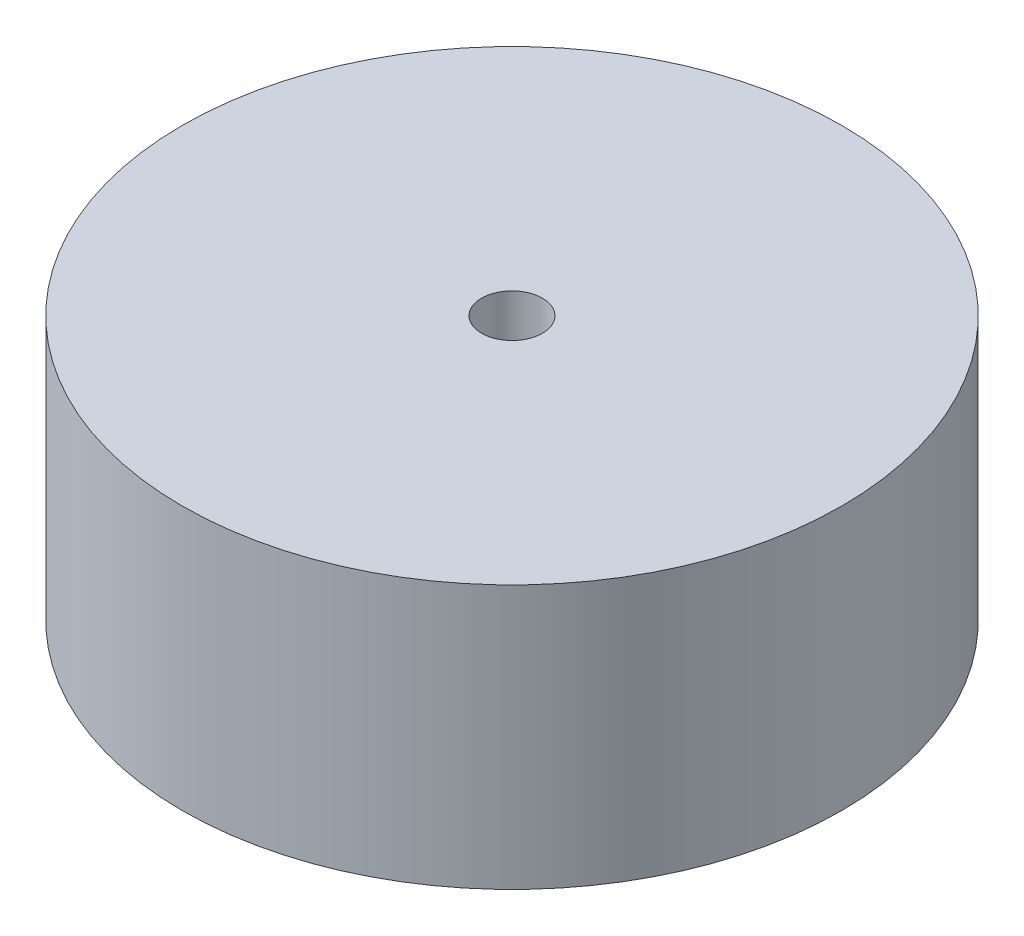
ISO-10303-21;
HEADER;
FILE_DESCRIPTION(('STEP AP214'),'2;1');
FILE_NAME('part.step','',(''),(''),'','','');
FILE_SCHEMA(('AUTOMOTIVE_DESIGN { 1 0 10303 214 1 1 1 1 }'));
ENDSEC;
DATA;
#1=APPLICATION_CONTEXT('core data for automotive mechanical design processes');
#2=APPLICATION_PROTOCOL_DEFINITION('international standard','automotive_design',2000,#1);
#3=PRODUCT_CONTEXT('',#1,'mechanical');
#4=PRODUCT('Part','Part','',(#3));
#5=PRODUCT_RELATED_PRODUCT_CATEGORY('part','',(#4));
#6=PRODUCT_DEFINITION_FORMATION('','',#4);
#7=PRODUCT_DEFINITION_CONTEXT('part definition',#1,'design');
#8=PRODUCT_DEFINITION('design','',#6,#7);
#9=PRODUCT_DEFINITION_SHAPE('','',#8);
#10=(LENGTH_UNIT() NAMED_UNIT(*) SI_UNIT(.MILLI.,.METRE.));
#11=(NAMED_UNIT(*) PLANE_ANGLE_UNIT() SI_UNIT($,.RADIAN.));
#12=(NAMED_UNIT(*) SI_UNIT($,.STERADIAN.) SOLID_ANGLE_UNIT());
#13=UNCERTAINTY_MEASURE_WITH_UNIT(LENGTH_MEASURE(1.E-05),#10,'distance_accuracy_value','');
#14=(GEOMETRIC_REPRESENTATION_CONTEXT(3) GLOBAL_UNCERTAINTY_ASSIGNED_CONTEXT((#13)) GLOBAL_UNIT_ASSIGNED_CONTEXT((#10,
#11,#12)) REPRESENTATION_CONTEXT('',''));
#15=CARTESIAN_POINT('',(0.,0.,0.));
#16=DIRECTION('',(0.,0.,1.));
#17=DIRECTION('',(1.,0.,0.));
#18=AXIS2_PLACEMENT_3D('',#15,#16,#17);
#19=CARTESIAN_POINT('',(0.,26.,0.));
#20=DIRECTION('',(0.,-1.,0.));
#21=DIRECTION('',(0.,0.,-1.));
#22=AXIS2_PLACEMENT_3D('',#19,#20,#21);
#23=CYLINDRICAL_SURFACE('',#22,32.5);
#24=CARTESIAN_POINT('',(0.,26.,0.));
#25=DIRECTION('',(0.,1.,0.));
#26=DIRECTION('',(0.,0.,1.));
#27=AXIS2_PLACEMENT_3D('',#24,#25,#26);
#28=CIRCLE('',#27,32.5);
#29=CARTESIAN_POINT('',(0.,26.,-32.5));
#30=VERTEX_POINT('',#29);
#31=EDGE_CURVE('E45',#30,#30,#28,.T.);
#32=CARTESIAN_POINT('',(0.,0.,0.));
#33=DIRECTION('',(0.,1.,0.));
#34=DIRECTION('',(0.,0.,1.));
#35=AXIS2_PLACEMENT_3D('',#32,#33,#34);
#36=CIRCLE('',#35,32.5);
#37=CARTESIAN_POINT('',(0.,0.,-32.5));
#38=VERTEX_POINT('',#37);
#39=EDGE_CURVE('E40',#38,#38,#36,.T.);
#40=CARTESIAN_POINT('',(0.,26.,-32.5));
#41=CARTESIAN_POINT('',(0.,25.7291666666667,-32.5));
#42=CARTESIAN_POINT('',(0.,25.4583333333333,-32.5));
#43=CARTESIAN_POINT('',(0.,24.9166666666667,-32.5));
#44=CARTESIAN_POINT('',(0.,24.6458333333333,-32.5));
#45=CARTESIAN_POINT('',(0.,24.1041666666667,-32.5));
#46=CARTESIAN_POINT('',(0.,23.8333333333333,-32.5));
#47=CARTESIAN_POINT('',(0.,23.2916666666667,-32.5));
#48=CARTESIAN_POINT('',(0.,23.0208333333333,-32.5));
#49=CARTESIAN_POINT('',(0.,22.4791666666667,-32.5));
#50=CARTESIAN_POINT('',(0.,22.2083333333333,-32.5));
#51=CARTESIAN_POINT('',(0.,21.6666666666667,-32.5));
#52=CARTESIAN_POINT('',(0.,21.3958333333333,-32.5));
#53=CARTESIAN_POINT('',(0.,20.8541666666667,-32.5));
#54=CARTESIAN_POINT('',(0.,20.5833333333333,-32.5));
#55=CARTESIAN_POINT('',(0.,20.0416666666667,-32.5));
#56=CARTESIAN_POINT('',(0.,19.7708333333333,-32.5));
#57=CARTESIAN_POINT('',(0.,19.2291666666667,-32.5));
#58=CARTESIAN_POINT('',(0.,18.9583333333333,-32.5));
#59=CARTESIAN_POINT('',(0.,18.4166666666667,-32.5));
#60=CARTESIAN_POINT('',(0.,18.1458333333333,-32.5));
#61=CARTESIAN_POINT('',(0.,17.6041666666667,-32.5));
#62=CARTESIAN_POINT('',(0.,17.3333333333333,-32.5));
#63=CARTESIAN_POINT('',(0.,16.7916666666667,-32.5));
#64=CARTESIAN_POINT('',(0.,16.5208333333333,-32.5));
#65=CARTESIAN_POINT('',(0.,15.9791666666667,-32.5));
#66=CARTESIAN_POINT('',(0.,15.7083333333333,-32.5));
#67=CARTESIAN_POINT('',(0.,15.1666666666667,-32.5));
#68=CARTESIAN_POINT('',(0.,14.8958333333333,-32.5));
#69=CARTESIAN_POINT('',(0.,14.3541666666667,-32.5));
#70=CARTESIAN_POINT('',(0.,14.0833333333333,-32.5));
#71=CARTESIAN_POINT('',(0.,13.5416666666667,-32.5));
#72=CARTESIAN_POINT('',(0.,13.2708333333333,-32.5));
#73=CARTESIAN_POINT('',(0.,12.7291666666667,-32.5));
#74=CARTESIAN_POINT('',(0.,12.4583333333333,-32.5));
#75=CARTESIAN_POINT('',(0.,11.9166666666667,-32.5));
#76=CARTESIAN_POINT('',(0.,11.6458333333333,-32.5));
#77=CARTESIAN_POINT('',(0.,11.1041666666667,-32.5));
#78=CARTESIAN_POINT('',(0.,10.8333333333333,-32.5));
#79=CARTESIAN_POINT('',(0.,10.2916666666667,-32.5));
#80=CARTESIAN_POINT('',(0.,10.0208333333333,-32.5));
#81=CARTESIAN_POINT('',(0.,9.47916666666667,-32.5));
#82=CARTESIAN_POINT('',(0.,9.20833333333333,-32.5));
#83=CARTESIAN_POINT('',(0.,8.66666666666667,-32.5));
#84=CARTESIAN_POINT('',(0.,8.39583333333333,-32.5));
#85=CARTESIAN_POINT('',(0.,7.85416666666667,-32.5));
#86=CARTESIAN_POINT('',(0.,7.58333333333333,-32.5));
#87=CARTESIAN_POINT('',(0.,7.04166666666667,-32.5));
#88=CARTESIAN_POINT('',(0.,6.77083333333333,-32.5));
#89=CARTESIAN_POINT('',(0.,6.22916666666667,-32.5));
#90=CARTESIAN_POINT('',(0.,5.95833333333333,-32.5));
#91=CARTESIAN_POINT('',(0.,5.41666666666667,-32.5));
#92=CARTESIAN_POINT('',(0.,5.14583333333333,-32.5));
#93=CARTESIAN_POINT('',(0.,4.60416666666667,-32.5));
#94=CARTESIAN_POINT('',(0.,4.33333333333333,-32.5));
#95=CARTESIAN_POINT('',(0.,3.79166666666667,-32.5));
#96=CARTESIAN_POINT('',(0.,3.52083333333333,-32.5));
#97=CARTESIAN_POINT('',(0.,2.97916666666667,-32.5));
#98=CARTESIAN_POINT('',(0.,2.70833333333333,-32.5));
#99=CARTESIAN_POINT('',(0.,2.16666666666667,-32.5));
#100=CARTESIAN_POINT('',(0.,1.89583333333333,-32.5));
#101=CARTESIAN_POINT('',(0.,1.35416666666667,-32.5));
#102=CARTESIAN_POINT('',(0.,1.08333333333333,-32.5));
#103=CARTESIAN_POINT('',(0.,0.541666666666667,-32.5));
#104=CARTESIAN_POINT('',(0.,0.270833333333334,-32.5));
#105=CARTESIAN_POINT('',(0.,0.,-32.5));
#106=B_SPLINE_CURVE_WITH_KNOTS('',3,(#40,#41,#42,#43,#44,#45,#46,#47,#48,#49,#50,#51,#52,#53,
#54,#55,#56,#57,#58,#59,#60,#61,#62,#63,#64,#65,#66,#67,#68,#69,#70,#71,#72,#73,#74,#75,#76,#77,
#78,#79,#80,#81,#82,#83,#84,#85,#86,#87,#88,#89,#90,#91,#92,#93,#94,#95,#96,#97,#98,#99,#100,
#101,#102,#103,#104,#105),.UNSPECIFIED.,.F.,.F.,(4,2,2,2,2,2,2,2,2,2,2,2,2,2,2,2,2,2,2,2,2,2,2,
2,2,2,2,2,2,2,2,2,4),(0.,0.812500000000001,1.625,2.4375,3.25,4.0625,4.875,5.6875,6.5,7.3125,
8.125,8.9375,9.75,10.5625,11.375,12.1875,13.,13.8125,14.625,15.4375,16.25,17.0625,17.875,
18.6875,19.5,20.3125,21.125,21.9375,22.75,23.5625,24.375,25.1875,26.),.UNSPECIFIED.);
#107=EDGE_CURVE('BSEAM37',#30,#38,#106,.T.);
#108=ORIENTED_EDGE('',*,*,#31,.F.);
#109=ORIENTED_EDGE('',*,*,#39,.T.);
#110=ORIENTED_EDGE('',*,*,#107,.T.);
#111=ORIENTED_EDGE('',*,*,#107,.F.);
#112=EDGE_LOOP('',(#108,#110,#109,#111));
#113=FACE_BOUND('',#112,.T.);
#114=ADVANCED_FACE('F37',(#113),#23,.T.);
#115=CARTESIAN_POINT('',(0.,26.,0.));
#116=DIRECTION('',(0.,1.,0.));
#117=DIRECTION('',(0.,0.,1.));
#118=AXIS2_PLACEMENT_3D('',#115,#116,#117);
#119=PLANE('',#118);
#120=CARTESIAN_POINT('',(0.,26.,0.));
#121=DIRECTION('',(0.,1.,0.));
#122=DIRECTION('',(0.,0.,1.));
#123=AXIS2_PLACEMENT_3D('',#120,#121,#122);
#124=CIRCLE('',#123,3.);
#125=CARTESIAN_POINT('',(0.,26.,-3.));
#126=VERTEX_POINT('',#125);
#127=EDGE_CURVE('E56',#126,#126,#124,.T.);
#128=ORIENTED_EDGE('',*,*,#127,.F.);
#129=EDGE_LOOP('',(#128));
#130=FACE_BOUND('',#129,.T.);
#131=ORIENTED_EDGE('',*,*,#31,.T.);
#132=EDGE_LOOP('',(#131));
#133=FACE_BOUND('',#132,.T.);
#134=ADVANCED_FACE('F80',(#130,#133),#119,.T.);
#135=CARTESIAN_POINT('',(0.,0.,0.));
#136=DIRECTION('',(0.,1.,0.));
#137=DIRECTION('',(0.,0.,1.));
#138=AXIS2_PLACEMENT_3D('',#135,#136,#137);
#139=PLANE('',#138);
#140=CARTESIAN_POINT('',(0.,0.,0.));
#141=DIRECTION('',(0.,-1.,0.));
#142=DIRECTION('',(0.,0.,-1.));
#143=AXIS2_PLACEMENT_3D('',#140,#141,#142);
#144=CIRCLE('',#143,6.);
#145=CARTESIAN_POINT('',(0.,0.,-6.));
#146=VERTEX_POINT('',#145);
#147=EDGE_CURVE('E10',#146,#146,#144,.T.);
#148=ORIENTED_EDGE('',*,*,#147,.F.);
#149=EDGE_LOOP('',(#148));
#150=FACE_BOUND('',#149,.T.);
#151=ORIENTED_EDGE('',*,*,#39,.F.);
#152=EDGE_LOOP('',(#151));
#153=FACE_BOUND('',#152,.T.);
#154=ADVANCED_FACE('F75',(#150,#153),#139,.F.);
#155=CARTESIAN_POINT('',(0.,-4.,0.));
#156=DIRECTION('',(0.,1.,0.));
#157=DIRECTION('',(0.,0.,1.));
#158=AXIS2_PLACEMENT_3D('',#155,#156,#157);
#159=CYLINDRICAL_SURFACE('',#158,6.);
#160=CARTESIAN_POINT('',(0.,-4.,0.));
#161=DIRECTION('',(0.,-1.,0.));
#162=DIRECTION('',(0.,0.,-1.));
#163=AXIS2_PLACEMENT_3D('',#160,#161,#162);
#164=CIRCLE('',#163,6.);
#165=CARTESIAN_POINT('',(0.,-4.,-6.));
#166=VERTEX_POINT('',#165);
#167=EDGE_CURVE('E52',#166,#166,#164,.T.);
#168=ORIENTED_EDGE('',*,*,#167,.F.);
#169=EDGE_LOOP('',(#168));
#170=FACE_BOUND('',#169,.T.);
#171=ORIENTED_EDGE('',*,*,#147,.T.);
#172=EDGE_LOOP('',(#171));
#173=FACE_BOUND('',#172,.T.);
#174=ADVANCED_FACE('F70',(#170,#173),#159,.T.);
#175=CARTESIAN_POINT('',(0.,-4.,0.));
#176=DIRECTION('',(0.,-1.,0.));
#177=DIRECTION('',(0.,0.,-1.));
#178=AXIS2_PLACEMENT_3D('',#175,#176,#177);
#179=PLANE('',#178);
#180=CARTESIAN_POINT('',(0.,-4.,0.));
#181=DIRECTION('',(0.,-1.,0.));
#182=DIRECTION('',(0.,0.,-1.));
#183=AXIS2_PLACEMENT_3D('',#180,#181,#182);
#184=CIRCLE('',#183,3.);
#185=CARTESIAN_POINT('',(0.,-4.,-3.));
#186=VERTEX_POINT('',#185);
#187=EDGE_CURVE('E60',#186,#186,#184,.T.);
#188=ORIENTED_EDGE('',*,*,#187,.F.);
#189=EDGE_LOOP('',(#188));
#190=FACE_BOUND('',#189,.T.);
#191=ORIENTED_EDGE('',*,*,#167,.T.);
#192=EDGE_LOOP('',(#191));
#193=FACE_BOUND('',#192,.T.);
#194=ADVANCED_FACE('F67',(#190,#193),#179,.T.);
#195=CARTESIAN_POINT('',(0.,48.,0.));
#196=DIRECTION('',(0.,-1.,0.));
#197=DIRECTION('',(0.,0.,-1.));
#198=AXIS2_PLACEMENT_3D('',#195,#196,#197);
#199=CYLINDRICAL_SURFACE('',#198,3.);
#200=CARTESIAN_POINT('',(0.,26.,-3.));
#201=CARTESIAN_POINT('',(0.,25.6875,-3.));
#202=CARTESIAN_POINT('',(0.,25.375,-3.));
#203=CARTESIAN_POINT('',(0.,24.75,-3.));
#204=CARTESIAN_POINT('',(0.,24.4375,-3.));
#205=CARTESIAN_POINT('',(0.,23.8125,-3.));
#206=CARTESIAN_POINT('',(0.,23.5,-3.));
#207=CARTESIAN_POINT('',(0.,22.875,-3.));
#208=CARTESIAN_POINT('',(0.,22.5625,-3.));
#209=CARTESIAN_POINT('',(0.,21.9375,-3.));
#210=CARTESIAN_POINT('',(0.,21.625,-3.));
#211=CARTESIAN_POINT('',(0.,21.,-3.));
#212=CARTESIAN_POINT('',(0.,20.6875,-3.));
#213=CARTESIAN_POINT('',(0.,20.0625,-3.));
#214=CARTESIAN_POINT('',(0.,19.75,-3.));
#215=CARTESIAN_POINT('',(0.,19.125,-3.));
#216=CARTESIAN_POINT('',(0.,18.8125,-3.));
#217=CARTESIAN_POINT('',(0.,18.1875,-3.));
#218=CARTESIAN_POINT('',(0.,17.875,-3.));
#219=CARTESIAN_POINT('',(0.,17.25,-3.));
#220=CARTESIAN_POINT('',(0.,16.9375,-3.));
#221=CARTESIAN_POINT('',(0.,16.3125,-3.));
#222=CARTESIAN_POINT('',(0.,16.,-3.));
#223=CARTESIAN_POINT('',(0.,15.375,-3.));
#224=CARTESIAN_POINT('',(0.,15.0625,-3.));
#225=CARTESIAN_POINT('',(0.,14.4375,-3.));
#226=CARTESIAN_POINT('',(0.,14.125,-3.));
#227=CARTESIAN_POINT('',(0.,13.5,-3.));
#228=CARTESIAN_POINT('',(0.,13.1875,-3.));
#229=CARTESIAN_POINT('',(0.,12.5625,-3.));
#230=CARTESIAN_POINT('',(0.,12.25,-3.));
#231=CARTESIAN_POINT('',(0.,11.625,-3.));
#232=CARTESIAN_POINT('',(0.,11.3125,-3.));
#233=CARTESIAN_POINT('',(0.,10.6875,-3.));
#234=CARTESIAN_POINT('',(0.,10.375,-3.));
#235=CARTESIAN_POINT('',(0.,9.75,-3.));
#236=CARTESIAN_POINT('',(0.,9.4375,-3.));
#237=CARTESIAN_POINT('',(0.,8.8125,-3.));
#238=CARTESIAN_POINT('',(0.,8.50000000000001,-3.));
#239=CARTESIAN_POINT('',(0.,7.87500000000001,-3.));
#240=CARTESIAN_POINT('',(0.,7.5625,-3.));
#241=CARTESIAN_POINT('',(0.,6.9375,-3.));
#242=CARTESIAN_POINT('',(0.,6.625,-3.));
#243=CARTESIAN_POINT('',(0.,6.00000000000001,-3.));
#244=CARTESIAN_POINT('',(0.,5.68750000000001,-3.));
#245=CARTESIAN_POINT('',(0.,5.0625,-3.));
#246=CARTESIAN_POINT('',(0.,4.75,-3.));
#247=CARTESIAN_POINT('',(0.,4.125,-3.));
#248=CARTESIAN_POINT('',(0.,3.8125,-3.));
#249=CARTESIAN_POINT('',(0.,3.1875,-3.));
#250=CARTESIAN_POINT('',(0.,2.875,-3.));
#251=CARTESIAN_POINT('',(0.,2.25,-3.));
#252=CARTESIAN_POINT('',(0.,1.9375,-3.));
#253=CARTESIAN_POINT('',(0.,1.3125,-3.));
#254=CARTESIAN_POINT('',(0.,1.,-3.));
#255=CARTESIAN_POINT('',(0.,0.375000000000003,-3.));
#256=CARTESIAN_POINT('',(0.,0.0625000000000047,-3.));
#257=CARTESIAN_POINT('',(0.,-0.562499999999996,-3.));
#258=CARTESIAN_POINT('',(0.,-0.874999999999998,-3.));
#259=CARTESIAN_POINT('',(0.,-1.5,-3.));
#260=CARTESIAN_POINT('',(0.,-1.8125,-3.));
#261=CARTESIAN_POINT('',(0.,-2.4375,-3.));
#262=CARTESIAN_POINT('',(0.,-2.75,-3.));
#263=CARTESIAN_POINT('',(0.,-3.375,-3.));
#264=CARTESIAN_POINT('',(0.,-3.6875,-3.));
#265=CARTESIAN_POINT('',(0.,-4.,-3.));
#266=B_SPLINE_CURVE_WITH_KNOTS('',3,(#200,#201,#202,#203,#204,#205,#206,#207,#208,#209,#210,
#211,#212,#213,#214,#215,#216,#217,#218,#219,#220,#221,#222,#223,#224,#225,#226,#227,#228,#229,
#230,#231,#232,#233,#234,#235,#236,#237,#238,#239,#240,#241,#242,#243,#244,#245,#246,#247,#248,
#249,#250,#251,#252,#253,#254,#255,#256,#257,#258,#259,#260,#261,#262,#263,#264,#265),
.UNSPECIFIED.,.F.,.F.,(4,2,2,2,2,2,2,2,2,2,2,2,2,2,2,2,2,2,2,2,2,2,2,2,2,2,2,2,2,2,2,2,4),(0.,
0.937500000000001,1.875,2.8125,3.75,4.6875,5.625,6.5625,7.5,8.4375,9.375,10.3125,11.25,12.1875,
13.125,14.0625,15.,15.9375,16.875,17.8125,18.75,19.6875,20.625,21.5625,22.5,23.4375,24.375,
25.3125,26.25,27.1875,28.125,29.0625,30.),.UNSPECIFIED.);
#267=EDGE_CURVE('BSEAM65',#126,#186,#266,.T.);
#268=ORIENTED_EDGE('',*,*,#127,.T.);
#269=ORIENTED_EDGE('',*,*,#187,.T.);
#270=ORIENTED_EDGE('',*,*,#267,.T.);
#271=ORIENTED_EDGE('',*,*,#267,.F.);
#272=EDGE_LOOP('',(#268,#270,#269,#271));
#273=FACE_BOUND('',#272,.T.);
#274=ADVANCED_FACE('F65',(#273),#199,.F.);
#275=CLOSED_SHELL('',(#114,#134,#154,#174,#194,#274));
#276=MANIFOLD_SOLID_BREP('B2',#275);
#277=ADVANCED_BREP_SHAPE_REPRESENTATION('',(#18,#276),#14);
#278=SHAPE_DEFINITION_REPRESENTATION(#9,#277);
ENDSEC;
END-ISO-10303-21;
